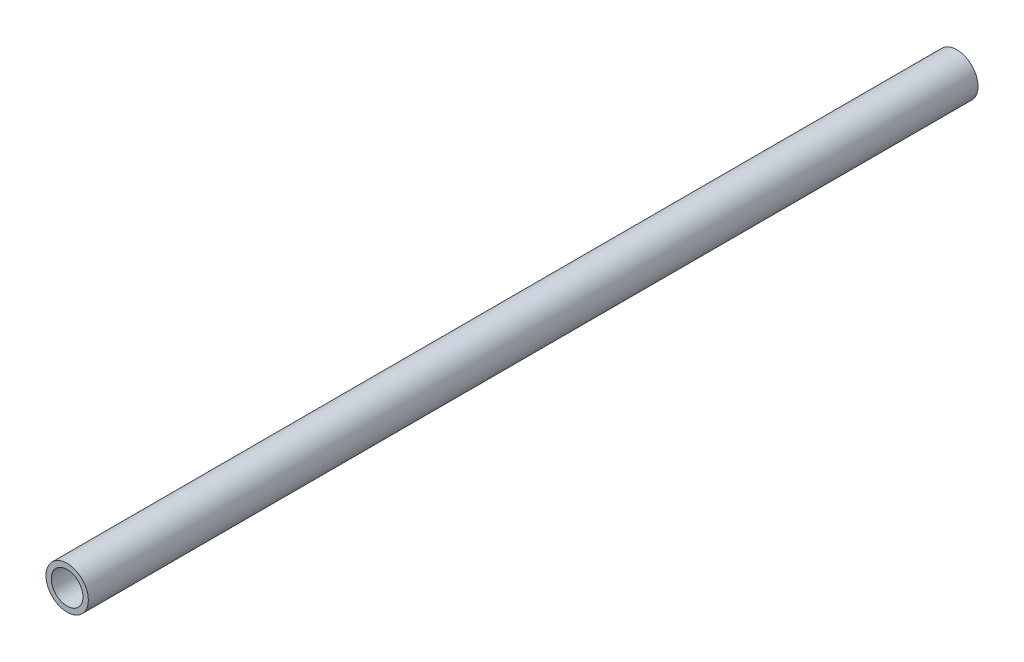
ISO-10303-21;
HEADER;
FILE_DESCRIPTION(('STEP AP214'),'2;1');
FILE_NAME('part.step','',(''),(''),'','','');
FILE_SCHEMA(('AUTOMOTIVE_DESIGN { 1 0 10303 214 1 1 1 1 }'));
ENDSEC;
DATA;
#1=APPLICATION_CONTEXT('core data for automotive mechanical design processes');
#2=APPLICATION_PROTOCOL_DEFINITION('international standard','automotive_design',2000,#1);
#3=PRODUCT_CONTEXT('',#1,'mechanical');
#4=PRODUCT('Part','Part','',(#3));
#5=PRODUCT_RELATED_PRODUCT_CATEGORY('part','',(#4));
#6=PRODUCT_DEFINITION_FORMATION('','',#4);
#7=PRODUCT_DEFINITION_CONTEXT('part definition',#1,'design');
#8=PRODUCT_DEFINITION('design','',#6,#7);
#9=PRODUCT_DEFINITION_SHAPE('','',#8);
#10=(LENGTH_UNIT() NAMED_UNIT(*) SI_UNIT(.MILLI.,.METRE.));
#11=(NAMED_UNIT(*) PLANE_ANGLE_UNIT() SI_UNIT($,.RADIAN.));
#12=(NAMED_UNIT(*) SI_UNIT($,.STERADIAN.) SOLID_ANGLE_UNIT());
#13=UNCERTAINTY_MEASURE_WITH_UNIT(LENGTH_MEASURE(1.E-05),#10,'distance_accuracy_value','');
#14=(GEOMETRIC_REPRESENTATION_CONTEXT(3) GLOBAL_UNCERTAINTY_ASSIGNED_CONTEXT((#13)) GLOBAL_UNIT_ASSIGNED_CONTEXT((#10,
#11,#12)) REPRESENTATION_CONTEXT('',''));
#15=CARTESIAN_POINT('',(0.,0.,0.));
#16=DIRECTION('',(0.,0.,1.));
#17=DIRECTION('',(1.,0.,0.));
#18=AXIS2_PLACEMENT_3D('',#15,#16,#17);
#19=CARTESIAN_POINT('',(0.,0.,533.4));
#20=DIRECTION('',(0.,0.,1.));
#21=DIRECTION('',(1.,0.,0.));
#22=AXIS2_PLACEMENT_3D('',#19,#20,#21);
#23=PLANE('',#22);
#24=CARTESIAN_POINT('',(0.,0.,533.4));
#25=DIRECTION('',(0.,0.,1.));
#26=DIRECTION('',(1.,0.,0.));
#27=AXIS2_PLACEMENT_3D('',#24,#25,#26);
#28=CIRCLE('',#27,12.7);
#29=CARTESIAN_POINT('',(12.7,0.,533.4));
#30=VERTEX_POINT('',#29);
#31=EDGE_CURVE('E10',#30,#30,#28,.T.);
#32=ORIENTED_EDGE('',*,*,#31,.T.);
#33=EDGE_LOOP('',(#32));
#34=FACE_BOUND('',#33,.T.);
#35=CARTESIAN_POINT('',(0.,0.,533.4));
#36=DIRECTION('',(0.,0.,1.));
#37=DIRECTION('',(1.,0.,0.));
#38=AXIS2_PLACEMENT_3D('',#35,#36,#37);
#39=CIRCLE('',#38,9.525);
#40=CARTESIAN_POINT('',(9.525,0.,533.4));
#41=VERTEX_POINT('',#40);
#42=EDGE_CURVE('E44',#41,#41,#39,.T.);
#43=ORIENTED_EDGE('',*,*,#42,.F.);
#44=EDGE_LOOP('',(#43));
#45=FACE_BOUND('',#44,.T.);
#46=ADVANCED_FACE('F33',(#34,#45),#23,.T.);
#47=CARTESIAN_POINT('',(0.,0.,0.));
#48=DIRECTION('',(0.,0.,1.));
#49=DIRECTION('',(1.,0.,0.));
#50=AXIS2_PLACEMENT_3D('',#47,#48,#49);
#51=PLANE('',#50);
#52=CARTESIAN_POINT('',(0.,0.,0.));
#53=DIRECTION('',(0.,0.,1.));
#54=DIRECTION('',(1.,0.,0.));
#55=AXIS2_PLACEMENT_3D('',#52,#53,#54);
#56=CIRCLE('',#55,12.7);
#57=CARTESIAN_POINT('',(12.7,0.,0.));
#58=VERTEX_POINT('',#57);
#59=EDGE_CURVE('E37',#58,#58,#56,.T.);
#60=ORIENTED_EDGE('',*,*,#59,.F.);
#61=EDGE_LOOP('',(#60));
#62=FACE_BOUND('',#61,.T.);
#63=CARTESIAN_POINT('',(0.,0.,0.));
#64=DIRECTION('',(0.,0.,1.));
#65=DIRECTION('',(1.,0.,0.));
#66=AXIS2_PLACEMENT_3D('',#63,#64,#65);
#67=CIRCLE('',#66,9.525);
#68=CARTESIAN_POINT('',(9.525,0.,0.));
#69=VERTEX_POINT('',#68);
#70=EDGE_CURVE('E46',#69,#69,#67,.T.);
#71=ORIENTED_EDGE('',*,*,#70,.T.);
#72=EDGE_LOOP('',(#71));
#73=FACE_BOUND('',#72,.T.);
#74=ADVANCED_FACE('F56',(#62,#73),#51,.F.);
#75=CARTESIAN_POINT('',(0.,0.,533.4));
#76=DIRECTION('',(0.,0.,-1.));
#77=DIRECTION('',(-1.,0.,0.));
#78=AXIS2_PLACEMENT_3D('',#75,#76,#77);
#79=CYLINDRICAL_SURFACE('',#78,12.7);
#80=ORIENTED_EDGE('',*,*,#31,.F.);
#81=EDGE_LOOP('',(#80));
#82=FACE_BOUND('',#81,.T.);
#83=ORIENTED_EDGE('',*,*,#59,.T.);
#84=EDGE_LOOP('',(#83));
#85=FACE_BOUND('',#84,.T.);
#86=ADVANCED_FACE('F35',(#82,#85),#79,.T.);
#87=CARTESIAN_POINT('',(0.,0.,533.4));
#88=DIRECTION('',(0.,0.,-1.));
#89=DIRECTION('',(-1.,0.,0.));
#90=AXIS2_PLACEMENT_3D('',#87,#88,#89);
#91=CYLINDRICAL_SURFACE('',#90,9.525);
#92=ORIENTED_EDGE('',*,*,#42,.T.);
#93=EDGE_LOOP('',(#92));
#94=FACE_BOUND('',#93,.T.);
#95=ORIENTED_EDGE('',*,*,#70,.F.);
#96=EDGE_LOOP('',(#95));
#97=FACE_BOUND('',#96,.T.);
#98=ADVANCED_FACE('F52',(#94,#97),#91,.F.);
#99=CLOSED_SHELL('',(#46,#74,#86,#98));
#100=MANIFOLD_SOLID_BREP('B2',#99);
#101=ADVANCED_BREP_SHAPE_REPRESENTATION('',(#18,#100),#14);
#102=SHAPE_DEFINITION_REPRESENTATION(#9,#101);
ENDSEC;
END-ISO-10303-21;
